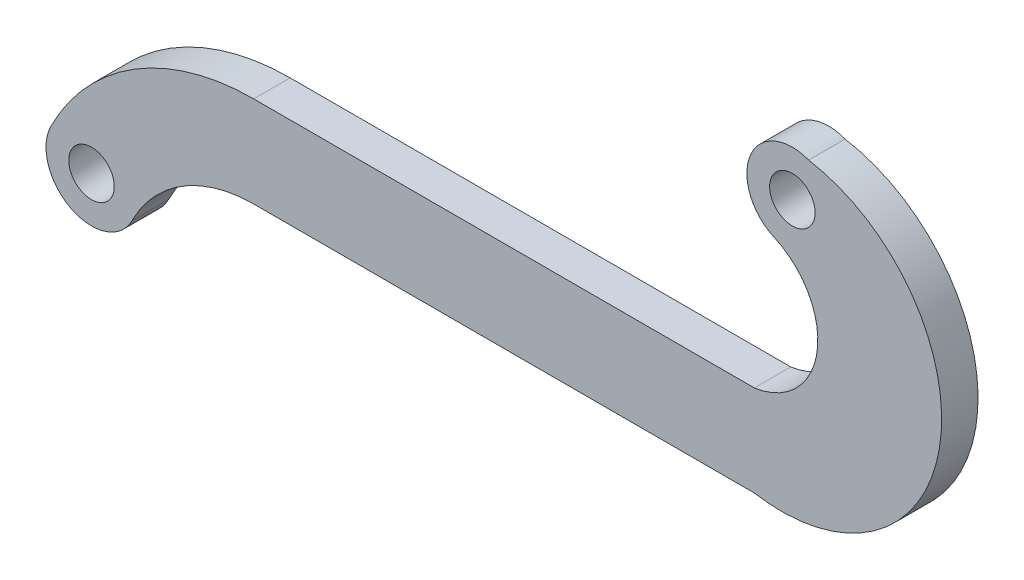
ISO-10303-21;
HEADER;
FILE_DESCRIPTION(('STEP AP214'),'2;1');
FILE_NAME('part.step','',(''),(''),'','','');
FILE_SCHEMA(('AUTOMOTIVE_DESIGN { 1 0 10303 214 1 1 1 1 }'));
ENDSEC;
DATA;
#1=APPLICATION_CONTEXT('core data for automotive mechanical design processes');
#2=APPLICATION_PROTOCOL_DEFINITION('international standard','automotive_design',2000,#1);
#3=PRODUCT_CONTEXT('',#1,'mechanical');
#4=PRODUCT('Part','Part','',(#3));
#5=PRODUCT_RELATED_PRODUCT_CATEGORY('part','',(#4));
#6=PRODUCT_DEFINITION_FORMATION('','',#4);
#7=PRODUCT_DEFINITION_CONTEXT('part definition',#1,'design');
#8=PRODUCT_DEFINITION('design','',#6,#7);
#9=PRODUCT_DEFINITION_SHAPE('','',#8);
#10=(LENGTH_UNIT() NAMED_UNIT(*) SI_UNIT(.MILLI.,.METRE.));
#11=(NAMED_UNIT(*) PLANE_ANGLE_UNIT() SI_UNIT($,.RADIAN.));
#12=(NAMED_UNIT(*) SI_UNIT($,.STERADIAN.) SOLID_ANGLE_UNIT());
#13=UNCERTAINTY_MEASURE_WITH_UNIT(LENGTH_MEASURE(1.E-05),#10,'distance_accuracy_value','');
#14=(GEOMETRIC_REPRESENTATION_CONTEXT(3) GLOBAL_UNCERTAINTY_ASSIGNED_CONTEXT((#13)) GLOBAL_UNIT_ASSIGNED_CONTEXT((#10,
#11,#12)) REPRESENTATION_CONTEXT('',''));
#15=CARTESIAN_POINT('',(0.,0.,0.));
#16=DIRECTION('',(0.,0.,1.));
#17=DIRECTION('',(1.,0.,0.));
#18=AXIS2_PLACEMENT_3D('',#15,#16,#17);
#19=CARTESIAN_POINT('',(0.,-5.97524133072559,1.6));
#20=DIRECTION('',(0.,0.,-1.));
#21=DIRECTION('',(-1.,0.,0.));
#22=AXIS2_PLACEMENT_3D('',#19,#20,#21);
#23=PLANE('',#22);
#24=CARTESIAN_POINT('',(0.,-5.97524133072559,1.6));
#25=DIRECTION('',(0.,0.,-1.));
#26=DIRECTION('',(-1.,0.,0.));
#27=AXIS2_PLACEMENT_3D('',#24,#25,#26);
#28=CIRCLE('',#27,5.97524133072559);
#29=CARTESIAN_POINT('',(-5.34118992692994,-3.29658511447209,1.6));
#30=VERTEX_POINT('',#29);
#31=CARTESIAN_POINT('',(0.,0.,1.6));
#32=VERTEX_POINT('',#31);
#33=EDGE_CURVE('E145',#30,#32,#28,.T.);
#34=ORIENTED_EDGE('',*,*,#33,.T.);
#35=DIRECTION('',(1.,0.,0.));
#36=VECTOR('',#35,1.);
#37=CARTESIAN_POINT('',(0.,0.,1.6));
#38=LINE('',#37,#36);
#39=CARTESIAN_POINT('',(22.,0.,1.6));
#40=VERTEX_POINT('',#39);
#41=EDGE_CURVE('E93',#32,#40,#38,.T.);
#42=ORIENTED_EDGE('',*,*,#41,.T.);
#43=CARTESIAN_POINT('',(23.1962258598353,6.93267890569139,1.6));
#44=DIRECTION('',(0.,0.,1.));
#45=DIRECTION('',(1.,0.,0.));
#46=AXIS2_PLACEMENT_3D('',#43,#44,#45);
#47=CIRCLE('',#46,7.03512566463152);
#48=CARTESIAN_POINT('',(24.3924517196706,13.8653578113828,1.6));
#49=VERTEX_POINT('',#48);
#50=EDGE_CURVE('E160',#40,#49,#47,.T.);
#51=ORIENTED_EDGE('',*,*,#50,.T.);
#52=CARTESIAN_POINT('',(23.6710362807498,12.,1.6));
#53=DIRECTION('',(0.,0.,1.));
#54=DIRECTION('',(1.,0.,0.));
#55=AXIS2_PLACEMENT_3D('',#52,#53,#54);
#56=CIRCLE('',#55,2.);
#57=CARTESIAN_POINT('',(22.8617250514024,10.1710616921142,1.6));
#58=VERTEX_POINT('',#57);
#59=EDGE_CURVE('E173',#49,#58,#56,.T.);
#60=ORIENTED_EDGE('',*,*,#59,.T.);
#61=CARTESIAN_POINT('',(21.5507504990817,7.20842940374737,1.6));
#62=DIRECTION('',(0.,0.,-1.));
#63=DIRECTION('',(1.,0.,0.));
#64=AXIS2_PLACEMENT_3D('',#61,#62,#63);
#65=CIRCLE('',#64,3.23972905547764);
#66=CARTESIAN_POINT('',(22.,4.,1.6));
#67=VERTEX_POINT('',#66);
#68=EDGE_CURVE('E112',#58,#67,#65,.T.);
#69=ORIENTED_EDGE('',*,*,#68,.T.);
#70=DIRECTION('',(-1.,0.,0.));
#71=VECTOR('',#70,1.);
#72=CARTESIAN_POINT('',(22.,4.,1.6));
#73=LINE('',#72,#71);
#74=CARTESIAN_POINT('',(0.,4.,1.6));
#75=VERTEX_POINT('',#74);
#76=EDGE_CURVE('E106',#67,#75,#73,.T.);
#77=ORIENTED_EDGE('',*,*,#76,.T.);
#78=CARTESIAN_POINT('',(0.,-5.97524133072559,1.6));
#79=DIRECTION('',(0.,0.,1.));
#80=DIRECTION('',(1.,0.,0.));
#81=AXIS2_PLACEMENT_3D('',#78,#79,#80);
#82=CIRCLE('',#81,9.97524133072559);
#83=CARTESIAN_POINT('',(-8.9167375115704,-1.50341488552791,1.6));
#84=VERTEX_POINT('',#83);
#85=EDGE_CURVE('E110',#75,#84,#82,.T.);
#86=ORIENTED_EDGE('',*,*,#85,.T.);
#87=CARTESIAN_POINT('',(-7.12896371925017,-2.4,1.6));
#88=DIRECTION('',(0.,0.,1.));
#89=DIRECTION('',(1.,0.,0.));
#90=AXIS2_PLACEMENT_3D('',#87,#88,#89);
#91=CIRCLE('',#90,2.);
#92=EDGE_CURVE('E50',#84,#30,#91,.T.);
#93=ORIENTED_EDGE('',*,*,#92,.T.);
#94=EDGE_LOOP('',(#34,#42,#51,#60,#69,#77,#86,#93));
#95=FACE_BOUND('',#94,.T.);
#96=CARTESIAN_POINT('',(23.6710362807498,12.,1.6));
#97=DIRECTION('',(0.,0.,1.));
#98=DIRECTION('',(1.,0.,0.));
#99=AXIS2_PLACEMENT_3D('',#96,#97,#98);
#100=CIRCLE('',#99,1.);
#101=CARTESIAN_POINT('',(24.6710362807498,12.,1.6));
#102=VERTEX_POINT('',#101);
#103=EDGE_CURVE('E134',#102,#102,#100,.T.);
#104=ORIENTED_EDGE('',*,*,#103,.F.);
#105=EDGE_LOOP('',(#104));
#106=FACE_BOUND('',#105,.T.);
#107=CARTESIAN_POINT('',(-7.12896371925017,-2.4,1.6));
#108=DIRECTION('',(0.,0.,1.));
#109=DIRECTION('',(1.,0.,0.));
#110=AXIS2_PLACEMENT_3D('',#107,#108,#109);
#111=CIRCLE('',#110,1.);
#112=CARTESIAN_POINT('',(-6.12896371925017,-2.4,1.6));
#113=VERTEX_POINT('',#112);
#114=EDGE_CURVE('E182',#113,#113,#111,.T.);
#115=ORIENTED_EDGE('',*,*,#114,.F.);
#116=EDGE_LOOP('',(#115));
#117=FACE_BOUND('',#116,.T.);
#118=ADVANCED_FACE('F33',(#95,#106,#117),#23,.F.);
#119=CARTESIAN_POINT('',(0.,-5.97524133072559,0.));
#120=DIRECTION('',(0.,0.,-1.));
#121=DIRECTION('',(-1.,0.,0.));
#122=AXIS2_PLACEMENT_3D('',#119,#120,#121);
#123=PLANE('',#122);
#124=CARTESIAN_POINT('',(23.6710362807498,12.,0.));
#125=DIRECTION('',(0.,0.,1.));
#126=DIRECTION('',(1.,0.,0.));
#127=AXIS2_PLACEMENT_3D('',#124,#125,#126);
#128=CIRCLE('',#127,1.);
#129=CARTESIAN_POINT('',(24.6710362807498,12.,0.));
#130=VERTEX_POINT('',#129);
#131=EDGE_CURVE('E179',#130,#130,#128,.T.);
#132=ORIENTED_EDGE('',*,*,#131,.T.);
#133=EDGE_LOOP('',(#132));
#134=FACE_BOUND('',#133,.T.);
#135=CARTESIAN_POINT('',(0.,-5.97524133072559,0.));
#136=DIRECTION('',(0.,0.,-1.));
#137=DIRECTION('',(-1.,0.,0.));
#138=AXIS2_PLACEMENT_3D('',#135,#136,#137);
#139=CIRCLE('',#138,5.97524133072559);
#140=CARTESIAN_POINT('',(-5.34118992692994,-3.29658511447209,0.));
#141=VERTEX_POINT('',#140);
#142=CARTESIAN_POINT('',(0.,0.,0.));
#143=VERTEX_POINT('',#142);
#144=EDGE_CURVE('E130',#141,#143,#139,.T.);
#145=ORIENTED_EDGE('',*,*,#144,.F.);
#146=CARTESIAN_POINT('',(-7.12896371925017,-2.4,0.));
#147=DIRECTION('',(0.,0.,1.));
#148=DIRECTION('',(1.,0.,0.));
#149=AXIS2_PLACEMENT_3D('',#146,#147,#148);
#150=CIRCLE('',#149,2.);
#151=CARTESIAN_POINT('',(-8.9167375115704,-1.50341488552791,0.));
#152=VERTEX_POINT('',#151);
#153=EDGE_CURVE('E85',#152,#141,#150,.T.);
#154=ORIENTED_EDGE('',*,*,#153,.F.);
#155=CARTESIAN_POINT('',(0.,-5.97524133072559,0.));
#156=DIRECTION('',(0.,0.,1.));
#157=DIRECTION('',(1.,0.,0.));
#158=AXIS2_PLACEMENT_3D('',#155,#156,#157);
#159=CIRCLE('',#158,9.97524133072559);
#160=CARTESIAN_POINT('',(0.,4.,0.));
#161=VERTEX_POINT('',#160);
#162=EDGE_CURVE('E79',#161,#152,#159,.T.);
#163=ORIENTED_EDGE('',*,*,#162,.F.);
#164=DIRECTION('',(-1.,0.,0.));
#165=VECTOR('',#164,1.);
#166=CARTESIAN_POINT('',(22.,4.,0.));
#167=LINE('',#166,#165);
#168=CARTESIAN_POINT('',(22.,4.,0.));
#169=VERTEX_POINT('',#168);
#170=EDGE_CURVE('E120',#169,#161,#167,.T.);
#171=ORIENTED_EDGE('',*,*,#170,.F.);
#172=CARTESIAN_POINT('',(21.5507504990817,7.20842940374737,0.));
#173=DIRECTION('',(0.,0.,-1.));
#174=DIRECTION('',(1.,0.,0.));
#175=AXIS2_PLACEMENT_3D('',#172,#173,#174);
#176=CIRCLE('',#175,3.23972905547764);
#177=CARTESIAN_POINT('',(22.8617250514024,10.1710616921142,0.));
#178=VERTEX_POINT('',#177);
#179=EDGE_CURVE('E140',#178,#169,#176,.T.);
#180=ORIENTED_EDGE('',*,*,#179,.F.);
#181=CARTESIAN_POINT('',(23.6710362807498,12.,0.));
#182=DIRECTION('',(0.,0.,1.));
#183=DIRECTION('',(1.,0.,0.));
#184=AXIS2_PLACEMENT_3D('',#181,#182,#183);
#185=CIRCLE('',#184,2.);
#186=CARTESIAN_POINT('',(24.3924517196706,13.8653578113828,0.));
#187=VERTEX_POINT('',#186);
#188=EDGE_CURVE('E138',#187,#178,#185,.T.);
#189=ORIENTED_EDGE('',*,*,#188,.F.);
#190=CARTESIAN_POINT('',(23.1962258598353,6.93267890569139,0.));
#191=DIRECTION('',(0.,0.,1.));
#192=DIRECTION('',(1.,0.,0.));
#193=AXIS2_PLACEMENT_3D('',#190,#191,#192);
#194=CIRCLE('',#193,7.03512566463152);
#195=CARTESIAN_POINT('',(22.,0.,0.));
#196=VERTEX_POINT('',#195);
#197=EDGE_CURVE('E136',#196,#187,#194,.T.);
#198=ORIENTED_EDGE('',*,*,#197,.F.);
#199=DIRECTION('',(1.,0.,0.));
#200=VECTOR('',#199,1.);
#201=CARTESIAN_POINT('',(0.,0.,0.));
#202=LINE('',#201,#200);
#203=EDGE_CURVE('E133',#143,#196,#202,.T.);
#204=ORIENTED_EDGE('',*,*,#203,.F.);
#205=EDGE_LOOP('',(#145,#154,#163,#171,#180,#189,#198,#204));
#206=FACE_BOUND('',#205,.T.);
#207=CARTESIAN_POINT('',(-7.12896371925017,-2.4,0.));
#208=DIRECTION('',(0.,0.,1.));
#209=DIRECTION('',(1.,0.,0.));
#210=AXIS2_PLACEMENT_3D('',#207,#208,#209);
#211=CIRCLE('',#210,1.);
#212=CARTESIAN_POINT('',(-6.12896371925017,-2.4,0.));
#213=VERTEX_POINT('',#212);
#214=EDGE_CURVE('E185',#213,#213,#211,.T.);
#215=ORIENTED_EDGE('',*,*,#214,.T.);
#216=EDGE_LOOP('',(#215));
#217=FACE_BOUND('',#216,.T.);
#218=ADVANCED_FACE('F164',(#134,#206,#217),#123,.T.);
#219=CARTESIAN_POINT('',(0.,-5.97524133072559,1.6));
#220=DIRECTION('',(0.,0.,-1.));
#221=DIRECTION('',(-1.,0.,0.));
#222=AXIS2_PLACEMENT_3D('',#219,#220,#221);
#223=CYLINDRICAL_SURFACE('',#222,5.97524133072559);
#224=ORIENTED_EDGE('',*,*,#144,.T.);
#225=DIRECTION('',(0.,0.,-1.));
#226=VECTOR('',#225,1.);
#227=CARTESIAN_POINT('',(0.,0.,1.6));
#228=LINE('',#227,#226);
#229=EDGE_CURVE('E11',#32,#143,#228,.T.);
#230=ORIENTED_EDGE('',*,*,#229,.F.);
#231=ORIENTED_EDGE('',*,*,#33,.F.);
#232=DIRECTION('',(0.,0.,-1.));
#233=VECTOR('',#232,1.);
#234=CARTESIAN_POINT('',(-5.34118992692994,-3.29658511447209,1.6));
#235=LINE('',#234,#233);
#236=EDGE_CURVE('E126',#30,#141,#235,.T.);
#237=ORIENTED_EDGE('',*,*,#236,.T.);
#238=EDGE_LOOP('',(#224,#230,#231,#237));
#239=FACE_BOUND('',#238,.T.);
#240=ADVANCED_FACE('F35',(#239),#223,.F.);
#241=CARTESIAN_POINT('',(0.,0.,1.6));
#242=DIRECTION('',(0.,1.,0.));
#243=DIRECTION('',(0.,0.,1.));
#244=AXIS2_PLACEMENT_3D('',#241,#242,#243);
#245=PLANE('',#244);
#246=ORIENTED_EDGE('',*,*,#203,.T.);
#247=DIRECTION('',(0.,0.,-1.));
#248=VECTOR('',#247,1.);
#249=CARTESIAN_POINT('',(22.,0.,1.6));
#250=LINE('',#249,#248);
#251=EDGE_CURVE('E42',#40,#196,#250,.T.);
#252=ORIENTED_EDGE('',*,*,#251,.F.);
#253=ORIENTED_EDGE('',*,*,#41,.F.);
#254=ORIENTED_EDGE('',*,*,#229,.T.);
#255=EDGE_LOOP('',(#246,#252,#253,#254));
#256=FACE_BOUND('',#255,.T.);
#257=ADVANCED_FACE('F217',(#256),#245,.F.);
#258=CARTESIAN_POINT('',(23.1962258598353,6.93267890569139,1.6));
#259=DIRECTION('',(0.,0.,-1.));
#260=DIRECTION('',(-1.,0.,0.));
#261=AXIS2_PLACEMENT_3D('',#258,#259,#260);
#262=CYLINDRICAL_SURFACE('',#261,7.03512566463152);
#263=ORIENTED_EDGE('',*,*,#197,.T.);
#264=DIRECTION('',(0.,0.,-1.));
#265=VECTOR('',#264,1.);
#266=CARTESIAN_POINT('',(24.3924517196706,13.8653578113828,1.6));
#267=LINE('',#266,#265);
#268=EDGE_CURVE('E152',#49,#187,#267,.T.);
#269=ORIENTED_EDGE('',*,*,#268,.F.);
#270=ORIENTED_EDGE('',*,*,#50,.F.);
#271=ORIENTED_EDGE('',*,*,#251,.T.);
#272=EDGE_LOOP('',(#263,#269,#270,#271));
#273=FACE_BOUND('',#272,.T.);
#274=ADVANCED_FACE('F158',(#273),#262,.T.);
#275=CARTESIAN_POINT('',(23.6710362807498,12.,1.6));
#276=DIRECTION('',(0.,0.,-1.));
#277=DIRECTION('',(-1.,0.,0.));
#278=AXIS2_PLACEMENT_3D('',#275,#276,#277);
#279=CYLINDRICAL_SURFACE('',#278,2.);
#280=ORIENTED_EDGE('',*,*,#188,.T.);
#281=DIRECTION('',(0.,0.,-1.));
#282=VECTOR('',#281,1.);
#283=CARTESIAN_POINT('',(22.8617250514024,10.1710616921142,1.6));
#284=LINE('',#283,#282);
#285=EDGE_CURVE('E149',#58,#178,#284,.T.);
#286=ORIENTED_EDGE('',*,*,#285,.F.);
#287=ORIENTED_EDGE('',*,*,#59,.F.);
#288=ORIENTED_EDGE('',*,*,#268,.T.);
#289=EDGE_LOOP('',(#280,#286,#287,#288));
#290=FACE_BOUND('',#289,.T.);
#291=ADVANCED_FACE('F169',(#290),#279,.T.);
#292=CARTESIAN_POINT('',(21.5507504990817,7.20842940374737,1.6));
#293=DIRECTION('',(0.,0.,-1.));
#294=DIRECTION('',(-1.,0.,0.));
#295=AXIS2_PLACEMENT_3D('',#292,#293,#294);
#296=CYLINDRICAL_SURFACE('',#295,3.23972905547764);
#297=ORIENTED_EDGE('',*,*,#179,.T.);
#298=DIRECTION('',(0.,0.,-1.));
#299=VECTOR('',#298,1.);
#300=CARTESIAN_POINT('',(22.,4.,1.6));
#301=LINE('',#300,#299);
#302=EDGE_CURVE('E121',#67,#169,#301,.T.);
#303=ORIENTED_EDGE('',*,*,#302,.F.);
#304=ORIENTED_EDGE('',*,*,#68,.F.);
#305=ORIENTED_EDGE('',*,*,#285,.T.);
#306=EDGE_LOOP('',(#297,#303,#304,#305));
#307=FACE_BOUND('',#306,.T.);
#308=ADVANCED_FACE('F172',(#307),#296,.F.);
#309=CARTESIAN_POINT('',(22.,4.,1.6));
#310=DIRECTION('',(0.,-1.,0.));
#311=DIRECTION('',(1.,0.,0.));
#312=AXIS2_PLACEMENT_3D('',#309,#310,#311);
#313=PLANE('',#312);
#314=ORIENTED_EDGE('',*,*,#170,.T.);
#315=DIRECTION('',(0.,0.,-1.));
#316=VECTOR('',#315,1.);
#317=CARTESIAN_POINT('',(0.,4.,1.6));
#318=LINE('',#317,#316);
#319=EDGE_CURVE('E117',#75,#161,#318,.T.);
#320=ORIENTED_EDGE('',*,*,#319,.F.);
#321=ORIENTED_EDGE('',*,*,#76,.F.);
#322=ORIENTED_EDGE('',*,*,#302,.T.);
#323=EDGE_LOOP('',(#314,#320,#321,#322));
#324=FACE_BOUND('',#323,.T.);
#325=ADVANCED_FACE('F118',(#324),#313,.F.);
#326=CARTESIAN_POINT('',(0.,-5.97524133072559,1.6));
#327=DIRECTION('',(0.,0.,-1.));
#328=DIRECTION('',(-1.,0.,0.));
#329=AXIS2_PLACEMENT_3D('',#326,#327,#328);
#330=CYLINDRICAL_SURFACE('',#329,9.97524133072559);
#331=ORIENTED_EDGE('',*,*,#162,.T.);
#332=DIRECTION('',(0.,0.,-1.));
#333=VECTOR('',#332,1.);
#334=CARTESIAN_POINT('',(-8.9167375115704,-1.50341488552791,1.6));
#335=LINE('',#334,#333);
#336=EDGE_CURVE('E122',#84,#152,#335,.T.);
#337=ORIENTED_EDGE('',*,*,#336,.F.);
#338=ORIENTED_EDGE('',*,*,#85,.F.);
#339=ORIENTED_EDGE('',*,*,#319,.T.);
#340=EDGE_LOOP('',(#331,#337,#338,#339));
#341=FACE_BOUND('',#340,.T.);
#342=ADVANCED_FACE('F124',(#341),#330,.T.);
#343=CARTESIAN_POINT('',(-7.12896371925017,-2.4,1.6));
#344=DIRECTION('',(0.,0.,-1.));
#345=DIRECTION('',(-1.,0.,0.));
#346=AXIS2_PLACEMENT_3D('',#343,#344,#345);
#347=CYLINDRICAL_SURFACE('',#346,2.);
#348=ORIENTED_EDGE('',*,*,#153,.T.);
#349=ORIENTED_EDGE('',*,*,#236,.F.);
#350=ORIENTED_EDGE('',*,*,#92,.F.);
#351=ORIENTED_EDGE('',*,*,#336,.T.);
#352=EDGE_LOOP('',(#348,#349,#350,#351));
#353=FACE_BOUND('',#352,.T.);
#354=ADVANCED_FACE('F205',(#353),#347,.T.);
#355=CARTESIAN_POINT('',(23.6710362807498,12.,1.6));
#356=DIRECTION('',(0.,0.,-1.));
#357=DIRECTION('',(-1.,0.,0.));
#358=AXIS2_PLACEMENT_3D('',#355,#356,#357);
#359=CYLINDRICAL_SURFACE('',#358,1.);
#360=ORIENTED_EDGE('',*,*,#103,.T.);
#361=EDGE_LOOP('',(#360));
#362=FACE_BOUND('',#361,.T.);
#363=ORIENTED_EDGE('',*,*,#131,.F.);
#364=EDGE_LOOP('',(#363));
#365=FACE_BOUND('',#364,.T.);
#366=ADVANCED_FACE('F202',(#362,#365),#359,.F.);
#367=CARTESIAN_POINT('',(-7.12896371925017,-2.4,1.6));
#368=DIRECTION('',(0.,0.,-1.));
#369=DIRECTION('',(-1.,0.,0.));
#370=AXIS2_PLACEMENT_3D('',#367,#368,#369);
#371=CYLINDRICAL_SURFACE('',#370,1.);
#372=ORIENTED_EDGE('',*,*,#114,.T.);
#373=EDGE_LOOP('',(#372));
#374=FACE_BOUND('',#373,.T.);
#375=ORIENTED_EDGE('',*,*,#214,.F.);
#376=EDGE_LOOP('',(#375));
#377=FACE_BOUND('',#376,.T.);
#378=ADVANCED_FACE('F191',(#374,#377),#371,.F.);
#379=CLOSED_SHELL('',(#118,#218,#240,#257,#274,#291,#308,#325,#342,#354,#366,#378));
#380=MANIFOLD_SOLID_BREP('B2',#379);
#381=ADVANCED_BREP_SHAPE_REPRESENTATION('',(#18,#380),#14);
#382=SHAPE_DEFINITION_REPRESENTATION(#9,#381);
ENDSEC;
END-ISO-10303-21;
